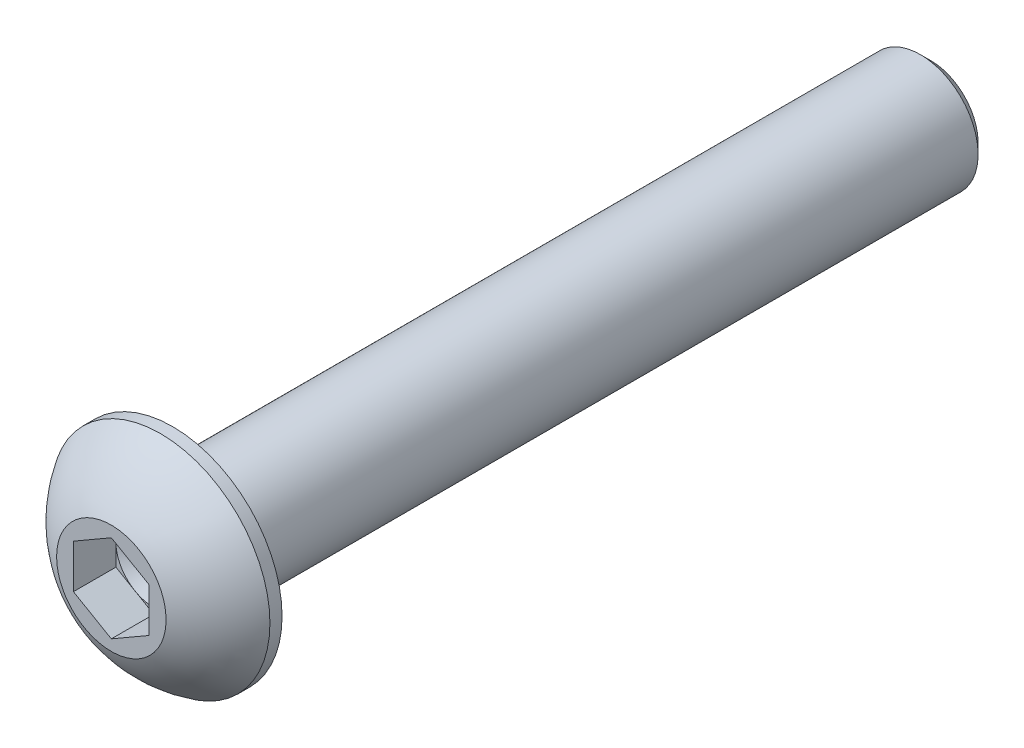
ISO-10303-21;
HEADER;
FILE_DESCRIPTION(('STEP AP214'),'2;1');
FILE_NAME('part.step','',(''),(''),'','','');
FILE_SCHEMA(('AUTOMOTIVE_DESIGN { 1 0 10303 214 1 1 1 1 }'));
ENDSEC;
DATA;
#1=APPLICATION_CONTEXT('core data for automotive mechanical design processes');
#2=APPLICATION_PROTOCOL_DEFINITION('international standard','automotive_design',2000,#1);
#3=PRODUCT_CONTEXT('',#1,'mechanical');
#4=PRODUCT('Part','Part','',(#3));
#5=PRODUCT_RELATED_PRODUCT_CATEGORY('part','',(#4));
#6=PRODUCT_DEFINITION_FORMATION('','',#4);
#7=PRODUCT_DEFINITION_CONTEXT('part definition',#1,'design');
#8=PRODUCT_DEFINITION('design','',#6,#7);
#9=PRODUCT_DEFINITION_SHAPE('','',#8);
#10=(LENGTH_UNIT() NAMED_UNIT(*) SI_UNIT(.MILLI.,.METRE.));
#11=(NAMED_UNIT(*) PLANE_ANGLE_UNIT() SI_UNIT($,.RADIAN.));
#12=(NAMED_UNIT(*) SI_UNIT($,.STERADIAN.) SOLID_ANGLE_UNIT());
#13=UNCERTAINTY_MEASURE_WITH_UNIT(LENGTH_MEASURE(1.E-05),#10,'distance_accuracy_value','');
#14=(GEOMETRIC_REPRESENTATION_CONTEXT(3) GLOBAL_UNCERTAINTY_ASSIGNED_CONTEXT((#13)) GLOBAL_UNIT_ASSIGNED_CONTEXT((#10,
#11,#12)) REPRESENTATION_CONTEXT('',''));
#15=CARTESIAN_POINT('',(0.,0.,0.));
#16=DIRECTION('',(0.,0.,1.));
#17=DIRECTION('',(1.,0.,0.));
#18=AXIS2_PLACEMENT_3D('',#15,#16,#17);
#19=CARTESIAN_POINT('',(0.,0.,-1.778));
#20=DIRECTION('',(0.,0.,1.));
#21=DIRECTION('',(1.,0.,0.));
#22=AXIS2_PLACEMENT_3D('',#19,#20,#21);
#23=PLANE('',#22);
#24=CARTESIAN_POINT('',(0.,0.,-1.778));
#25=DIRECTION('',(0.,0.,1.));
#26=DIRECTION('',(1.,0.,0.));
#27=AXIS2_PLACEMENT_3D('',#24,#25,#26);
#28=CIRCLE('',#27,1.5875);
#29=CARTESIAN_POINT('',(1.5875,0.,-1.778));
#30=VERTEX_POINT('',#29);
#31=CARTESIAN_POINT('',(0.79375,1.3748153285078,-1.778));
#32=VERTEX_POINT('',#31);
#33=EDGE_CURVE('E96',#30,#32,#28,.T.);
#34=ORIENTED_EDGE('',*,*,#33,.F.);
#35=DIRECTION('',(0.,-1.,0.));
#36=VECTOR('',#35,1.);
#37=CARTESIAN_POINT('',(1.5875,0.,-1.778));
#38=LINE('',#37,#36);
#39=CARTESIAN_POINT('',(1.5875,0.916543552338531,-1.778));
#40=VERTEX_POINT('',#39);
#41=EDGE_CURVE('E120',#40,#30,#38,.T.);
#42=ORIENTED_EDGE('',*,*,#41,.F.);
#43=DIRECTION('',(0.866025403784438,-0.5,0.));
#44=VECTOR('',#43,1.);
#45=CARTESIAN_POINT('',(0.79375,1.3748153285078,-1.778));
#46=LINE('',#45,#44);
#47=EDGE_CURVE('E118',#32,#40,#46,.T.);
#48=ORIENTED_EDGE('',*,*,#47,.F.);
#49=EDGE_LOOP('',(#34,#42,#48));
#50=FACE_BOUND('',#49,.T.);
#51=ADVANCED_FACE('F17',(#50),#23,.T.);
#52=CARTESIAN_POINT('',(-0.79375,1.37481532850779,-1.778));
#53=VERTEX_POINT('',#52);
#54=EDGE_CURVE('E98',#32,#53,#28,.T.);
#55=ORIENTED_EDGE('',*,*,#54,.F.);
#56=CARTESIAN_POINT('',(0.,1.83308710467706,-1.778));
#57=VERTEX_POINT('',#56);
#58=EDGE_CURVE('E113',#57,#32,#46,.T.);
#59=ORIENTED_EDGE('',*,*,#58,.F.);
#60=DIRECTION('',(0.866025403784437,0.5,0.));
#61=VECTOR('',#60,1.);
#62=CARTESIAN_POINT('',(-0.79375,1.37481532850779,-1.778));
#63=LINE('',#62,#61);
#64=EDGE_CURVE('E114',#53,#57,#63,.T.);
#65=ORIENTED_EDGE('',*,*,#64,.F.);
#66=EDGE_LOOP('',(#55,#59,#65));
#67=FACE_BOUND('',#66,.T.);
#68=ADVANCED_FACE('F111',(#67),#23,.T.);
#69=CARTESIAN_POINT('',(-1.5875,0.,-1.778));
#70=VERTEX_POINT('',#69);
#71=EDGE_CURVE('E117',#53,#70,#28,.T.);
#72=ORIENTED_EDGE('',*,*,#71,.F.);
#73=CARTESIAN_POINT('',(-1.5875,0.916543552338527,-1.778));
#74=VERTEX_POINT('',#73);
#75=EDGE_CURVE('E135',#74,#53,#63,.T.);
#76=ORIENTED_EDGE('',*,*,#75,.F.);
#77=DIRECTION('',(0.,1.,0.));
#78=VECTOR('',#77,1.);
#79=CARTESIAN_POINT('',(-1.5875,0.,-1.778));
#80=LINE('',#79,#78);
#81=EDGE_CURVE('E139',#70,#74,#80,.T.);
#82=ORIENTED_EDGE('',*,*,#81,.F.);
#83=EDGE_LOOP('',(#72,#76,#82));
#84=FACE_BOUND('',#83,.T.);
#85=ADVANCED_FACE('F229',(#84),#23,.T.);
#86=CARTESIAN_POINT('',(-0.79375,-1.3748153285078,-1.778));
#87=VERTEX_POINT('',#86);
#88=EDGE_CURVE('E253',#70,#87,#28,.T.);
#89=ORIENTED_EDGE('',*,*,#88,.F.);
#90=CARTESIAN_POINT('',(-1.5875,-0.916543552338531,-1.778));
#91=VERTEX_POINT('',#90);
#92=EDGE_CURVE('E140',#91,#70,#80,.T.);
#93=ORIENTED_EDGE('',*,*,#92,.F.);
#94=DIRECTION('',(-0.866025403784438,0.5,0.));
#95=VECTOR('',#94,1.);
#96=CARTESIAN_POINT('',(-0.79375,-1.3748153285078,-1.778));
#97=LINE('',#96,#95);
#98=EDGE_CURVE('E144',#87,#91,#97,.T.);
#99=ORIENTED_EDGE('',*,*,#98,.F.);
#100=EDGE_LOOP('',(#89,#93,#99));
#101=FACE_BOUND('',#100,.T.);
#102=ADVANCED_FACE('F241',(#101),#23,.T.);
#103=CARTESIAN_POINT('',(0.79375,-1.37481532850779,-1.778));
#104=VERTEX_POINT('',#103);
#105=EDGE_CURVE('E33',#87,#104,#28,.T.);
#106=ORIENTED_EDGE('',*,*,#105,.F.);
#107=CARTESIAN_POINT('',(0.,-1.83308710467706,-1.778));
#108=VERTEX_POINT('',#107);
#109=EDGE_CURVE('E145',#108,#87,#97,.T.);
#110=ORIENTED_EDGE('',*,*,#109,.F.);
#111=DIRECTION('',(-0.866025403784437,-0.5,0.));
#112=VECTOR('',#111,1.);
#113=CARTESIAN_POINT('',(0.79375,-1.37481532850779,-1.778));
#114=LINE('',#113,#112);
#115=EDGE_CURVE('E149',#104,#108,#114,.T.);
#116=ORIENTED_EDGE('',*,*,#115,.F.);
#117=EDGE_LOOP('',(#106,#110,#116));
#118=FACE_BOUND('',#117,.T.);
#119=ADVANCED_FACE('F234',(#118),#23,.T.);
#120=CARTESIAN_POINT('',(-1.146175,0.,0.));
#121=DIRECTION('',(0.,0.,1.));
#122=DIRECTION('',(1.,0.,0.));
#123=AXIS2_PLACEMENT_3D('',#120,#121,#122);
#124=PLANE('',#123);
#125=CARTESIAN_POINT('',(0.,0.,0.));
#126=DIRECTION('',(0.,0.,-1.));
#127=DIRECTION('',(-1.,0.,0.));
#128=AXIS2_PLACEMENT_3D('',#125,#126,#127);
#129=CIRCLE('',#128,2.29235);
#130=CARTESIAN_POINT('',(-2.29235000000001,0.,0.));
#131=VERTEX_POINT('',#130);
#132=EDGE_CURVE('E198',#131,#131,#129,.T.);
#133=ORIENTED_EDGE('',*,*,#132,.F.);
#134=EDGE_LOOP('',(#133));
#135=FACE_BOUND('',#134,.T.);
#136=DIRECTION('',(0.866025403784437,0.5,0.));
#137=VECTOR('',#136,1.);
#138=CARTESIAN_POINT('',(-0.79375,1.37481532850779,0.));
#139=LINE('',#138,#137);
#140=CARTESIAN_POINT('',(-1.5875,0.916543552338527,0.));
#141=VERTEX_POINT('',#140);
#142=CARTESIAN_POINT('',(0.,1.83308710467706,0.));
#143=VERTEX_POINT('',#142);
#144=EDGE_CURVE('E161',#141,#143,#139,.T.);
#145=ORIENTED_EDGE('',*,*,#144,.T.);
#146=DIRECTION('',(0.866025403784438,-0.5,0.));
#147=VECTOR('',#146,1.);
#148=CARTESIAN_POINT('',(0.79375,1.3748153285078,0.));
#149=LINE('',#148,#147);
#150=CARTESIAN_POINT('',(1.5875,0.916543552338531,0.));
#151=VERTEX_POINT('',#150);
#152=EDGE_CURVE('E106',#143,#151,#149,.T.);
#153=ORIENTED_EDGE('',*,*,#152,.T.);
#154=DIRECTION('',(0.,-1.,0.));
#155=VECTOR('',#154,1.);
#156=CARTESIAN_POINT('',(1.5875,0.,0.));
#157=LINE('',#156,#155);
#158=CARTESIAN_POINT('',(1.5875,-0.916543552338531,0.));
#159=VERTEX_POINT('',#158);
#160=EDGE_CURVE('E124',#151,#159,#157,.T.);
#161=ORIENTED_EDGE('',*,*,#160,.T.);
#162=DIRECTION('',(-0.866025403784437,-0.5,0.));
#163=VECTOR('',#162,1.);
#164=CARTESIAN_POINT('',(0.79375,-1.37481532850779,0.));
#165=LINE('',#164,#163);
#166=CARTESIAN_POINT('',(0.,-1.83308710467706,0.));
#167=VERTEX_POINT('',#166);
#168=EDGE_CURVE('E41',#159,#167,#165,.T.);
#169=ORIENTED_EDGE('',*,*,#168,.T.);
#170=DIRECTION('',(-0.866025403784438,0.5,0.));
#171=VECTOR('',#170,1.);
#172=CARTESIAN_POINT('',(-0.79375,-1.3748153285078,0.));
#173=LINE('',#172,#171);
#174=CARTESIAN_POINT('',(-1.5875,-0.916543552338531,0.));
#175=VERTEX_POINT('',#174);
#176=EDGE_CURVE('E169',#167,#175,#173,.T.);
#177=ORIENTED_EDGE('',*,*,#176,.T.);
#178=DIRECTION('',(0.,1.,0.));
#179=VECTOR('',#178,1.);
#180=CARTESIAN_POINT('',(-1.5875,0.,0.));
#181=LINE('',#180,#179);
#182=EDGE_CURVE('E165',#175,#141,#181,.T.);
#183=ORIENTED_EDGE('',*,*,#182,.T.);
#184=EDGE_LOOP('',(#145,#153,#161,#169,#177,#183));
#185=FACE_BOUND('',#184,.T.);
#186=ADVANCED_FACE('F240',(#135,#185),#124,.T.);
#187=CARTESIAN_POINT('',(0.,0.,1.48381805047393));
#188=DIRECTION('',(0.,0.,-1.));
#189=DIRECTION('',(-1.,0.,0.));
#190=AXIS2_PLACEMENT_3D('',#187,#188,#189);
#191=CYLINDRICAL_SURFACE('',#190,4.5847);
#192=CARTESIAN_POINT('',(0.,0.,-2.0574));
#193=DIRECTION('',(0.,0.,-1.));
#194=DIRECTION('',(-1.,0.,0.));
#195=AXIS2_PLACEMENT_3D('',#192,#193,#194);
#196=CIRCLE('',#195,4.5847);
#197=CARTESIAN_POINT('',(-4.5847,0.,-2.0574));
#198=VERTEX_POINT('',#197);
#199=EDGE_CURVE('E194',#198,#198,#196,.T.);
#200=ORIENTED_EDGE('',*,*,#199,.T.);
#201=EDGE_LOOP('',(#200));
#202=FACE_BOUND('',#201,.T.);
#203=CARTESIAN_POINT('',(0.,0.,-2.5654));
#204=DIRECTION('',(0.,0.,-1.));
#205=DIRECTION('',(-1.,0.,0.));
#206=AXIS2_PLACEMENT_3D('',#203,#204,#205);
#207=CIRCLE('',#206,4.5847);
#208=CARTESIAN_POINT('',(-4.5847,0.,-2.5654));
#209=VERTEX_POINT('',#208);
#210=EDGE_CURVE('E210',#209,#209,#207,.T.);
#211=ORIENTED_EDGE('',*,*,#210,.F.);
#212=EDGE_LOOP('',(#211));
#213=FACE_BOUND('',#212,.T.);
#214=ADVANCED_FACE('F246',(#202,#213),#191,.T.);
#215=CARTESIAN_POINT('',(-3.68935,0.,-2.5654));
#216=DIRECTION('',(0.,0.,-1.));
#217=DIRECTION('',(-1.,0.,0.));
#218=AXIS2_PLACEMENT_3D('',#215,#216,#217);
#219=PLANE('',#218);
#220=ORIENTED_EDGE('',*,*,#210,.T.);
#221=EDGE_LOOP('',(#220));
#222=FACE_BOUND('',#221,.T.);
#223=CARTESIAN_POINT('',(0.,0.,-2.5654));
#224=DIRECTION('',(0.,0.,-1.));
#225=DIRECTION('',(-1.,0.,0.));
#226=AXIS2_PLACEMENT_3D('',#223,#224,#225);
#227=CIRCLE('',#226,2.794);
#228=CARTESIAN_POINT('',(-2.794,0.,-2.5654));
#229=VERTEX_POINT('',#228);
#230=EDGE_CURVE('E206',#229,#229,#227,.T.);
#231=ORIENTED_EDGE('',*,*,#230,.F.);
#232=EDGE_LOOP('',(#231));
#233=FACE_BOUND('',#232,.T.);
#234=ADVANCED_FACE('F303',(#222,#233),#219,.T.);
#235=CARTESIAN_POINT('',(0.,0.,-2.9464));
#236=DIRECTION('',(0.,0.,-1.));
#237=DIRECTION('',(-1.,0.,0.));
#238=AXIS2_PLACEMENT_3D('',#235,#236,#237);
#239=TOROIDAL_SURFACE('',#238,2.794,0.381);
#240=ORIENTED_EDGE('',*,*,#230,.T.);
#241=EDGE_LOOP('',(#240));
#242=FACE_BOUND('',#241,.T.);
#243=CARTESIAN_POINT('',(0.,0.,-2.9464));
#244=DIRECTION('',(0.,0.,-1.));
#245=DIRECTION('',(-1.,0.,0.));
#246=AXIS2_PLACEMENT_3D('',#243,#244,#245);
#247=CIRCLE('',#246,2.413);
#248=CARTESIAN_POINT('',(-2.413,0.,-2.9464));
#249=VERTEX_POINT('',#248);
#250=EDGE_CURVE('E202',#249,#249,#247,.T.);
#251=ORIENTED_EDGE('',*,*,#250,.F.);
#252=EDGE_LOOP('',(#251));
#253=FACE_BOUND('',#252,.T.);
#254=ADVANCED_FACE('F299',(#242,#253),#239,.F.);
#255=CARTESIAN_POINT('',(0.,0.,1.48381805047393));
#256=DIRECTION('',(0.,0.,-1.));
#257=DIRECTION('',(-1.,0.,0.));
#258=AXIS2_PLACEMENT_3D('',#255,#256,#257);
#259=CYLINDRICAL_SURFACE('',#258,2.413);
#260=CARTESIAN_POINT('',(0.,0.,-33.88645761938));
#261=DIRECTION('',(0.,0.,-1.));
#262=DIRECTION('',(-1.,0.,0.));
#263=AXIS2_PLACEMENT_3D('',#260,#261,#262);
#264=CIRCLE('',#263,2.413);
#265=CARTESIAN_POINT('',(-2.413,0.,-33.88645761938));
#266=VERTEX_POINT('',#265);
#267=EDGE_CURVE('E11',#266,#266,#264,.F.);
#268=ORIENTED_EDGE('',*,*,#267,.T.);
#269=EDGE_LOOP('',(#268));
#270=FACE_BOUND('',#269,.T.);
#271=ORIENTED_EDGE('',*,*,#250,.T.);
#272=EDGE_LOOP('',(#271));
#273=FACE_BOUND('',#272,.T.);
#274=ADVANCED_FACE('F296',(#270,#273),#259,.T.);
#275=CARTESIAN_POINT('',(-1.2065,0.,-34.3154));
#276=DIRECTION('',(0.,0.,-1.));
#277=DIRECTION('',(-1.,0.,0.));
#278=AXIS2_PLACEMENT_3D('',#275,#276,#277);
#279=PLANE('',#278);
#280=CARTESIAN_POINT('',(0.,0.,-34.3154));
#281=DIRECTION('',(0.,0.,-1.));
#282=DIRECTION('',(-1.,0.,0.));
#283=AXIS2_PLACEMENT_3D('',#280,#281,#282);
#284=CIRCLE('',#283,1.98405761938);
#285=CARTESIAN_POINT('',(-1.98405761938,0.,-34.3154));
#286=VERTEX_POINT('',#285);
#287=EDGE_CURVE('E26',#286,#286,#284,.T.);
#288=ORIENTED_EDGE('',*,*,#287,.T.);
#289=EDGE_LOOP('',(#288));
#290=FACE_BOUND('',#289,.T.);
#291=ADVANCED_FACE('F218',(#290),#279,.T.);
#292=CARTESIAN_POINT('',(0.,0.,-4.85989606481481));
#293=DIRECTION('',(0.,0.,-1.));
#294=DIRECTION('',(-1.,0.,0.));
#295=AXIS2_PLACEMENT_3D('',#292,#293,#294);
#296=SPHERICAL_SURFACE('',#295,5.37340285883187);
#297=CARTESIAN_POINT('',(-4.5847,0.,-2.0574));
#298=CARTESIAN_POINT('',(-4.56772775071365,0.,-2.02963444466225));
#299=CARTESIAN_POINT('',(-4.55050321576171,0.,-2.00202310563314));
#300=CARTESIAN_POINT('',(-4.51555538986232,0.,-1.94711789153313));
#301=CARTESIAN_POINT('',(-4.49783209891487,0.,-1.91982401646224));
#302=CARTESIAN_POINT('',(-4.4618925763601,0.,-1.8655627616196));
#303=CARTESIAN_POINT('',(-4.44367634475278,0.,-1.83859538184787));
#304=CARTESIAN_POINT('',(-4.40675696303686,0.,-1.78499601309644));
#305=CARTESIAN_POINT('',(-4.38805381292827,0.,-1.75836402411674));
#306=CARTESIAN_POINT('',(-4.35016676527117,0.,-1.70544422925954));
#307=CARTESIAN_POINT('',(-4.33098286772266,0.,-1.67915642338203));
#308=CARTESIAN_POINT('',(-4.29214065809995,0.,-1.62693367141508));
#309=CARTESIAN_POINT('',(-4.27248234602574,0.,-1.60099872532564));
#310=CARTESIAN_POINT('',(-4.23269779601254,0.,-1.54949025368841));
#311=CARTESIAN_POINT('',(-4.21257155807355,0.,-1.52391672814064));
#312=CARTESIAN_POINT('',(-4.17185779967265,0.,-1.4731395388975));
#313=CARTESIAN_POINT('',(-4.15127027921075,0.,-1.44793587520214));
#314=CARTESIAN_POINT('',(-4.10964075130566,0.,-1.39790672892889));
#315=CARTESIAN_POINT('',(-4.08859874386249,0.,-1.37308124635099));
#316=CARTESIAN_POINT('',(-4.04606718757048,0.,-1.32381665673685));
#317=CARTESIAN_POINT('',(-4.02457763872164,0.,-1.29937754970059));
#318=CARTESIAN_POINT('',(-3.98115809291457,0.,-1.25089377806135));
#319=CARTESIAN_POINT('',(-3.95922809595633,0.,-1.22684911345837));
#320=CARTESIAN_POINT('',(-3.91493489261154,0.,-1.1791621633785));
#321=CARTESIAN_POINT('',(-3.892571686225,0.,-1.15551987790161));
#322=CARTESIAN_POINT('',(-3.84741944569869,0.,-1.10864548994917));
#323=CARTESIAN_POINT('',(-3.82463041155893,0.,-1.08541338747362));
#324=CARTESIAN_POINT('',(-3.77863403775912,0.,-1.03936703400529));
#325=CARTESIAN_POINT('',(-3.75542669809908,0.,-1.01655278301252));
#326=CARTESIAN_POINT('',(-3.70860137356642,0.,-0.971349663066289));
#327=CARTESIAN_POINT('',(-3.68498338869382,0.,-0.94896079411283));
#328=CARTESIAN_POINT('',(-3.63734456959005,0.,-0.904615828391113));
#329=CARTESIAN_POINT('',(-3.61332373535889,0.,-0.882659731622856));
#330=CARTESIAN_POINT('',(-3.56488714636506,0.,-0.839187557567447));
#331=CARTESIAN_POINT('',(-3.54047139160238,0.,-0.817671480280295));
#332=CARTESIAN_POINT('',(-3.4912530207284,0.,-0.775086447240822));
#333=CARTESIAN_POINT('',(-3.4664504046171,0.,-0.754017491488501));
#334=CARTESIAN_POINT('',(-3.41646649792444,0.,-0.712333655985979));
#335=CARTESIAN_POINT('',(-3.39128520734309,0.,-0.691718776235777));
#336=CARTESIAN_POINT('',(-3.34055226358225,0.,-0.650949897322802));
#337=CARTESIAN_POINT('',(-3.31500061040276,0.,-0.630795898160027));
#338=CARTESIAN_POINT('',(-3.26353537556731,0.,-0.590955432879197));
#339=CARTESIAN_POINT('',(-3.23762179391134,0.,-0.57126896676114));
#340=CARTESIAN_POINT('',(-3.18544125571044,0.,-0.532370065703055));
#341=CARTESIAN_POINT('',(-3.15917429916551,0.,-0.513157630763025));
#342=CARTESIAN_POINT('',(-3.10629568141643,0.,-0.475213133725829));
#343=CARTESIAN_POINT('',(-3.07968402021229,0.,-0.456481071628663));
#344=CARTESIAN_POINT('',(-3.02612477715573,0.,-0.419503503378719));
#345=CARTESIAN_POINT('',(-2.99917719530331,0.,-0.40125799722594));
#346=CARTESIAN_POINT('',(-2.94495500583993,0.,-0.365259563367945));
#347=CARTESIAN_POINT('',(-2.91768039822897,0.,-0.347506635662729));
#348=CARTESIAN_POINT('',(-2.8628131600919,0.,-0.312499218594777));
#349=CARTESIAN_POINT('',(-2.83522052956579,0.,-0.295244729232041));
#350=CARTESIAN_POINT('',(-2.77972635338319,0.,-0.261239884283562));
#351=CARTESIAN_POINT('',(-2.75182480772671,0.,-0.244489528697819));
#352=CARTESIAN_POINT('',(-2.69572201115466,0.,-0.211498480091079));
#353=CARTESIAN_POINT('',(-2.6675207602391,0.,-0.195257787070081));
#354=CARTESIAN_POINT('',(-2.61082786150165,0.,-0.163291425052401));
#355=CARTESIAN_POINT('',(-2.58233621367977,0.,-0.147565756055718));
#356=CARTESIAN_POINT('',(-2.52507192700006,0.,-0.116634630180611));
#357=CARTESIAN_POINT('',(-2.49629928814224,0.,-0.101429173302187));
#358=CARTESIAN_POINT('',(-2.43848251180434,0.,-0.0715435006068001));
#359=CARTESIAN_POINT('',(-2.40943837432427,0.,-0.0568632847898376));
#360=CARTESIAN_POINT('',(-2.35108820593536,0.,-0.0280329029080984));
#361=CARTESIAN_POINT('',(-2.32178217502651,0.,-0.0138827368433216));
#362=CARTESIAN_POINT('',(-2.29235000000001,0.,0.));
#363=B_SPLINE_CURVE_WITH_KNOTS('',3,(#297,#298,#299,#300,#301,#302,#303,#304,#305,#306,#307,
#308,#309,#310,#311,#312,#313,#314,#315,#316,#317,#318,#319,#320,#321,#322,#323,#324,#325,#326,
#327,#328,#329,#330,#331,#332,#333,#334,#335,#336,#337,#338,#339,#340,#341,#342,#343,#344,#345,
#346,#347,#348,#349,#350,#351,#352,#353,#354,#355,#356,#357,#358,#359,#360,#361,#362),
.UNSPECIFIED.,.F.,.F.,(4,2,2,2,2,2,2,2,2,2,2,2,2,2,2,2,2,2,2,2,2,2,2,2,2,2,2,2,2,2,2,2,4),(0.,
0.09762472664678,0.195249453293559,0.292874179940339,0.390498906587117,0.488123633233897,
0.585748359880676,0.683373086527455,0.780997813174235,0.878622539821013,0.976247266467793,
1.07387199311457,1.17149671976135,1.26912144640813,1.36674617305491,1.46437089970169,
1.56199562634847,1.65962035299525,1.75724507964203,1.85486980628881,1.95249453293559,
2.05011925958237,2.14774398622914,2.24536871287592,2.3429934395227,2.44061816616948,
2.53824289281626,2.63586761946304,2.73349234610982,2.8311170727566,2.92874179940338,
3.02636652605016,3.12399125269694),.UNSPECIFIED.);
#364=EDGE_CURVE('BSEAM287',#198,#131,#363,.T.);
#365=ORIENTED_EDGE('',*,*,#199,.F.);
#366=ORIENTED_EDGE('',*,*,#132,.T.);
#367=ORIENTED_EDGE('',*,*,#364,.T.);
#368=ORIENTED_EDGE('',*,*,#364,.F.);
#369=EDGE_LOOP('',(#365,#367,#366,#368));
#370=FACE_BOUND('',#369,.T.);
#371=ADVANCED_FACE('F287',(#370),#296,.T.);
#372=CARTESIAN_POINT('',(0.79375,1.3748153285078,-1.778));
#373=DIRECTION('',(-0.5,-0.866025403784438,0.));
#374=DIRECTION('',(0.866025403784438,-0.5,0.));
#375=AXIS2_PLACEMENT_3D('',#372,#373,#374);
#376=PLANE('',#375);
#377=ORIENTED_EDGE('',*,*,#152,.F.);
#378=DIRECTION('',(0.,0.,1.));
#379=VECTOR('',#378,1.);
#380=CARTESIAN_POINT('',(0.,1.83308710467706,-1.778));
#381=LINE('',#380,#379);
#382=EDGE_CURVE('E129',#57,#143,#381,.T.);
#383=ORIENTED_EDGE('',*,*,#382,.F.);
#384=ORIENTED_EDGE('',*,*,#58,.T.);
#385=ORIENTED_EDGE('',*,*,#47,.T.);
#386=DIRECTION('',(0.,0.,1.));
#387=VECTOR('',#386,1.);
#388=CARTESIAN_POINT('',(1.5875,0.916543552338531,-1.778));
#389=LINE('',#388,#387);
#390=EDGE_CURVE('E157',#40,#151,#389,.T.);
#391=ORIENTED_EDGE('',*,*,#390,.T.);
#392=EDGE_LOOP('',(#377,#383,#384,#385,#391));
#393=FACE_BOUND('',#392,.T.);
#394=ADVANCED_FACE('F128',(#393),#376,.T.);
#395=CARTESIAN_POINT('',(-0.79375,1.37481532850779,-1.778));
#396=DIRECTION('',(0.5,-0.866025403784437,0.));
#397=DIRECTION('',(0.866025403784437,0.5,0.));
#398=AXIS2_PLACEMENT_3D('',#395,#396,#397);
#399=PLANE('',#398);
#400=ORIENTED_EDGE('',*,*,#144,.F.);
#401=DIRECTION('',(0.,0.,1.));
#402=VECTOR('',#401,1.);
#403=CARTESIAN_POINT('',(-1.5875,0.916543552338527,-1.778));
#404=LINE('',#403,#402);
#405=EDGE_CURVE('E189',#74,#141,#404,.T.);
#406=ORIENTED_EDGE('',*,*,#405,.F.);
#407=ORIENTED_EDGE('',*,*,#75,.T.);
#408=ORIENTED_EDGE('',*,*,#64,.T.);
#409=ORIENTED_EDGE('',*,*,#382,.T.);
#410=EDGE_LOOP('',(#400,#406,#407,#408,#409));
#411=FACE_BOUND('',#410,.T.);
#412=ADVANCED_FACE('F280',(#411),#399,.T.);
#413=CARTESIAN_POINT('',(-1.5875,0.,-1.778));
#414=DIRECTION('',(1.,0.,0.));
#415=DIRECTION('',(0.,0.,-1.));
#416=AXIS2_PLACEMENT_3D('',#413,#414,#415);
#417=PLANE('',#416);
#418=ORIENTED_EDGE('',*,*,#182,.F.);
#419=DIRECTION('',(0.,0.,1.));
#420=VECTOR('',#419,1.);
#421=CARTESIAN_POINT('',(-1.5875,-0.916543552338531,-1.778));
#422=LINE('',#421,#420);
#423=EDGE_CURVE('E186',#91,#175,#422,.T.);
#424=ORIENTED_EDGE('',*,*,#423,.F.);
#425=ORIENTED_EDGE('',*,*,#92,.T.);
#426=ORIENTED_EDGE('',*,*,#81,.T.);
#427=ORIENTED_EDGE('',*,*,#405,.T.);
#428=EDGE_LOOP('',(#418,#424,#425,#426,#427));
#429=FACE_BOUND('',#428,.T.);
#430=ADVANCED_FACE('F275',(#429),#417,.T.);
#431=CARTESIAN_POINT('',(-0.79375,-1.3748153285078,-1.778));
#432=DIRECTION('',(0.5,0.866025403784438,0.));
#433=DIRECTION('',(-0.866025403784438,0.5,0.));
#434=AXIS2_PLACEMENT_3D('',#431,#432,#433);
#435=PLANE('',#434);
#436=ORIENTED_EDGE('',*,*,#176,.F.);
#437=DIRECTION('',(0.,0.,1.));
#438=VECTOR('',#437,1.);
#439=CARTESIAN_POINT('',(0.,-1.83308710467706,-1.778));
#440=LINE('',#439,#438);
#441=EDGE_CURVE('E183',#108,#167,#440,.T.);
#442=ORIENTED_EDGE('',*,*,#441,.F.);
#443=ORIENTED_EDGE('',*,*,#109,.T.);
#444=ORIENTED_EDGE('',*,*,#98,.T.);
#445=ORIENTED_EDGE('',*,*,#423,.T.);
#446=EDGE_LOOP('',(#436,#442,#443,#444,#445));
#447=FACE_BOUND('',#446,.T.);
#448=ADVANCED_FACE('F261',(#447),#435,.T.);
#449=CARTESIAN_POINT('',(0.79375,-1.37481532850779,-1.778));
#450=DIRECTION('',(-0.5,0.866025403784437,0.));
#451=DIRECTION('',(-0.866025403784437,-0.5,0.));
#452=AXIS2_PLACEMENT_3D('',#449,#450,#451);
#453=PLANE('',#452);
#454=ORIENTED_EDGE('',*,*,#168,.F.);
#455=DIRECTION('',(0.,0.,1.));
#456=VECTOR('',#455,1.);
#457=CARTESIAN_POINT('',(1.5875,-0.916543552338531,-1.778));
#458=LINE('',#457,#456);
#459=CARTESIAN_POINT('',(1.5875,-0.916543552338531,-1.778));
#460=VERTEX_POINT('',#459);
#461=EDGE_CURVE('E180',#460,#159,#458,.T.);
#462=ORIENTED_EDGE('',*,*,#461,.F.);
#463=EDGE_CURVE('E150',#460,#104,#114,.T.);
#464=ORIENTED_EDGE('',*,*,#463,.T.);
#465=ORIENTED_EDGE('',*,*,#115,.T.);
#466=ORIENTED_EDGE('',*,*,#441,.T.);
#467=EDGE_LOOP('',(#454,#462,#464,#465,#466));
#468=FACE_BOUND('',#467,.T.);
#469=ADVANCED_FACE('F237',(#468),#453,.T.);
#470=CARTESIAN_POINT('',(1.5875,0.,-1.778));
#471=DIRECTION('',(-1.,0.,0.));
#472=DIRECTION('',(0.,0.,1.));
#473=AXIS2_PLACEMENT_3D('',#470,#471,#472);
#474=PLANE('',#473);
#475=ORIENTED_EDGE('',*,*,#160,.F.);
#476=ORIENTED_EDGE('',*,*,#390,.F.);
#477=ORIENTED_EDGE('',*,*,#41,.T.);
#478=EDGE_CURVE('E154',#30,#460,#38,.T.);
#479=ORIENTED_EDGE('',*,*,#478,.T.);
#480=ORIENTED_EDGE('',*,*,#461,.T.);
#481=EDGE_LOOP('',(#475,#476,#477,#479,#480));
#482=FACE_BOUND('',#481,.T.);
#483=ADVANCED_FACE('F232',(#482),#474,.T.);
#484=EDGE_CURVE('E100',#104,#30,#28,.T.);
#485=ORIENTED_EDGE('',*,*,#484,.F.);
#486=ORIENTED_EDGE('',*,*,#463,.F.);
#487=ORIENTED_EDGE('',*,*,#478,.F.);
#488=EDGE_LOOP('',(#485,#486,#487));
#489=FACE_BOUND('',#488,.T.);
#490=ADVANCED_FACE('F93',(#489),#23,.T.);
#491=CARTESIAN_POINT('',(0.,0.,-1.778));
#492=DIRECTION('',(0.,0.,1.));
#493=DIRECTION('',(1.,0.,0.));
#494=AXIS2_PLACEMENT_3D('',#491,#492,#493);
#495=CONICAL_SURFACE('',#494,1.5875,1.0471975511966);
#496=CARTESIAN_POINT('',(0.,0.,-2.69454355233854));
#497=VERTEX_POINT('',#496);
#498=VERTEX_LOOP('',#497);
#499=FACE_BOUND('',#498,.T.);
#500=ORIENTED_EDGE('',*,*,#33,.T.);
#501=ORIENTED_EDGE('',*,*,#54,.T.);
#502=ORIENTED_EDGE('',*,*,#71,.T.);
#503=ORIENTED_EDGE('',*,*,#88,.T.);
#504=ORIENTED_EDGE('',*,*,#105,.T.);
#505=ORIENTED_EDGE('',*,*,#484,.T.);
#506=EDGE_LOOP('',(#500,#501,#502,#503,#504,#505));
#507=FACE_BOUND('',#506,.T.);
#508=ADVANCED_FACE('F91',(#499,#507),#495,.F.);
#509=CARTESIAN_POINT('',(0.,0.,-34.3154));
#510=DIRECTION('',(0.,0.,1.));
#511=DIRECTION('',(1.,0.,0.));
#512=AXIS2_PLACEMENT_3D('',#509,#510,#511);
#513=CONICAL_SURFACE('',#512,1.98405761938,0.785398163397445);
#514=ORIENTED_EDGE('',*,*,#267,.F.);
#515=EDGE_LOOP('',(#514));
#516=FACE_BOUND('',#515,.T.);
#517=ORIENTED_EDGE('',*,*,#287,.F.);
#518=EDGE_LOOP('',(#517));
#519=FACE_BOUND('',#518,.T.);
#520=ADVANCED_FACE('F19',(#516,#519),#513,.T.);
#521=CLOSED_SHELL('',(#51,#68,#85,#102,#119,#186,#214,#234,#254,#274,#291,#371,#394,#412,#430,
#448,#469,#483,#490,#508,#520));
#522=MANIFOLD_SOLID_BREP('B1',#521);
#523=ADVANCED_BREP_SHAPE_REPRESENTATION('',(#18,#522),#14);
#524=SHAPE_DEFINITION_REPRESENTATION(#9,#523);
ENDSEC;
END-ISO-10303-21;
